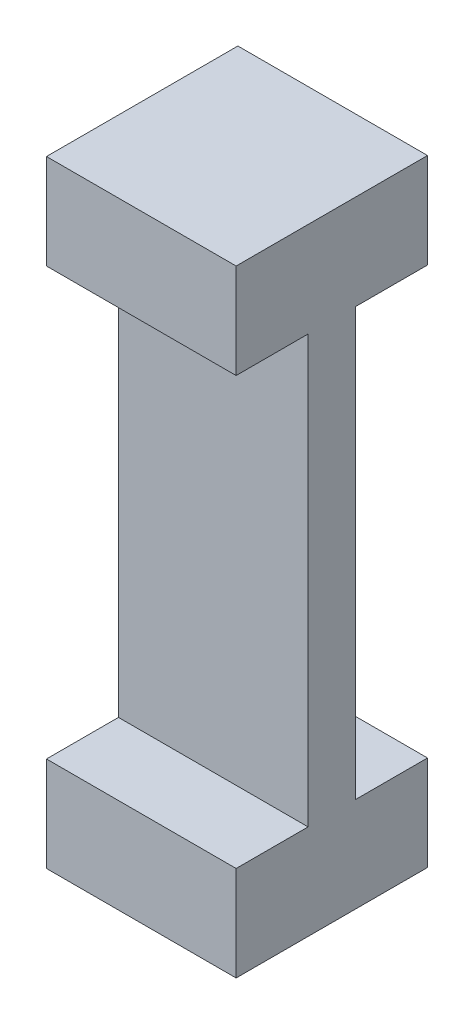
ISO-10303-21;
HEADER;
FILE_DESCRIPTION(('STEP AP214'),'2;1');
FILE_NAME('part.step','',(''),(''),'','','');
FILE_SCHEMA(('AUTOMOTIVE_DESIGN { 1 0 10303 214 1 1 1 1 }'));
ENDSEC;
DATA;
#1=APPLICATION_CONTEXT('core data for automotive mechanical design processes');
#2=APPLICATION_PROTOCOL_DEFINITION('international standard','automotive_design',2000,#1);
#3=PRODUCT_CONTEXT('',#1,'mechanical');
#4=PRODUCT('Part','Part','',(#3));
#5=PRODUCT_RELATED_PRODUCT_CATEGORY('part','',(#4));
#6=PRODUCT_DEFINITION_FORMATION('','',#4);
#7=PRODUCT_DEFINITION_CONTEXT('part definition',#1,'design');
#8=PRODUCT_DEFINITION('design','',#6,#7);
#9=PRODUCT_DEFINITION_SHAPE('','',#8);
#10=(LENGTH_UNIT() NAMED_UNIT(*) SI_UNIT(.MILLI.,.METRE.));
#11=(NAMED_UNIT(*) PLANE_ANGLE_UNIT() SI_UNIT($,.RADIAN.));
#12=(NAMED_UNIT(*) SI_UNIT($,.STERADIAN.) SOLID_ANGLE_UNIT());
#13=UNCERTAINTY_MEASURE_WITH_UNIT(LENGTH_MEASURE(1.E-05),#10,'distance_accuracy_value','');
#14=(GEOMETRIC_REPRESENTATION_CONTEXT(3) GLOBAL_UNCERTAINTY_ASSIGNED_CONTEXT((#13)) GLOBAL_UNIT_ASSIGNED_CONTEXT((#10,
#11,#12)) REPRESENTATION_CONTEXT('',''));
#15=CARTESIAN_POINT('',(0.,0.,0.));
#16=DIRECTION('',(0.,0.,1.));
#17=DIRECTION('',(1.,0.,0.));
#18=AXIS2_PLACEMENT_3D('',#15,#16,#17);
#19=CARTESIAN_POINT('',(48.4000143814819,130.,40.3791279410926));
#20=DIRECTION('',(-1.,0.,0.));
#21=DIRECTION('',(0.,0.,1.));
#22=AXIS2_PLACEMENT_3D('',#19,#20,#21);
#23=PLANE('',#22);
#24=DIRECTION('',(0.,-1.,0.));
#25=VECTOR('',#24,1.);
#26=CARTESIAN_POINT('',(48.4000143814819,360.,-9.97329326461638));
#27=LINE('',#26,#25);
#28=CARTESIAN_POINT('',(48.4000143814819,220.,-9.97329326461634));
#29=VERTEX_POINT('',#28);
#30=CARTESIAN_POINT('',(48.4000143814819,40.,-9.97329326461634));
#31=VERTEX_POINT('',#30);
#32=EDGE_CURVE('E174',#29,#31,#27,.T.);
#33=ORIENTED_EDGE('',*,*,#32,.F.);
#34=DIRECTION('',(0.,0.,-1.));
#35=VECTOR('',#34,1.);
#36=CARTESIAN_POINT('',(48.4000143814819,220.,-9.97329326461634));
#37=LINE('',#36,#35);
#38=CARTESIAN_POINT('',(48.4000143814819,220.,-40.3257144703254));
#39=VERTEX_POINT('',#38);
#40=EDGE_CURVE('E150',#29,#39,#37,.T.);
#41=ORIENTED_EDGE('',*,*,#40,.T.);
#42=DIRECTION('',(0.,1.,0.));
#43=VECTOR('',#42,1.);
#44=CARTESIAN_POINT('',(48.4000143814819,130.,-40.3257144703254));
#45=LINE('',#44,#43);
#46=CARTESIAN_POINT('',(48.4000143814819,260.,-40.3257144703254));
#47=VERTEX_POINT('',#46);
#48=EDGE_CURVE('E165',#39,#47,#45,.T.);
#49=ORIENTED_EDGE('',*,*,#48,.T.);
#50=DIRECTION('',(0.,0.,-1.));
#51=VECTOR('',#50,1.);
#52=CARTESIAN_POINT('',(48.4000143814819,260.,40.3791279410926));
#53=LINE('',#52,#51);
#54=CARTESIAN_POINT('',(48.4000143814819,260.,40.3791279410926));
#55=VERTEX_POINT('',#54);
#56=EDGE_CURVE('E154',#55,#47,#53,.T.);
#57=ORIENTED_EDGE('',*,*,#56,.F.);
#58=DIRECTION('',(0.,1.,0.));
#59=VECTOR('',#58,1.);
#60=CARTESIAN_POINT('',(48.4000143814819,130.,40.3791279410926));
#61=LINE('',#60,#59);
#62=CARTESIAN_POINT('',(48.4000143814819,220.,40.3791279410926));
#63=VERTEX_POINT('',#62);
#64=EDGE_CURVE('E135',#63,#55,#61,.T.);
#65=ORIENTED_EDGE('',*,*,#64,.F.);
#66=DIRECTION('',(0.,0.,-1.));
#67=VECTOR('',#66,1.);
#68=CARTESIAN_POINT('',(48.4000143814819,220.,10.0267067353836));
#69=LINE('',#68,#67);
#70=CARTESIAN_POINT('',(48.4000143814819,220.,10.0267067353836));
#71=VERTEX_POINT('',#70);
#72=EDGE_CURVE('E143',#63,#71,#69,.T.);
#73=ORIENTED_EDGE('',*,*,#72,.T.);
#74=DIRECTION('',(0.,1.,0.));
#75=VECTOR('',#74,1.);
#76=CARTESIAN_POINT('',(48.4000143814819,360.,10.0267067353836));
#77=LINE('',#76,#75);
#78=CARTESIAN_POINT('',(48.4000143814819,40.,10.0267067353836));
#79=VERTEX_POINT('',#78);
#80=EDGE_CURVE('E173',#79,#71,#77,.T.);
#81=ORIENTED_EDGE('',*,*,#80,.F.);
#82=DIRECTION('',(0.,0.,-1.));
#83=VECTOR('',#82,1.);
#84=CARTESIAN_POINT('',(48.4000143814819,40.,10.0267067353836));
#85=LINE('',#84,#83);
#86=CARTESIAN_POINT('',(48.4000143814819,40.,40.3791279410926));
#87=VERTEX_POINT('',#86);
#88=EDGE_CURVE('E170',#87,#79,#85,.T.);
#89=ORIENTED_EDGE('',*,*,#88,.F.);
#90=DIRECTION('',(0.,-1.,0.));
#91=VECTOR('',#90,1.);
#92=CARTESIAN_POINT('',(48.4000143814819,130.,40.3791279410926));
#93=LINE('',#92,#91);
#94=CARTESIAN_POINT('',(48.4000143814819,0.,40.3791279410926));
#95=VERTEX_POINT('',#94);
#96=EDGE_CURVE('E54',#87,#95,#93,.T.);
#97=ORIENTED_EDGE('',*,*,#96,.T.);
#98=DIRECTION('',(0.,0.,-1.));
#99=VECTOR('',#98,1.);
#100=CARTESIAN_POINT('',(48.4000143814819,0.,40.3791279410926));
#101=LINE('',#100,#99);
#102=CARTESIAN_POINT('',(48.4000143814819,0.,-40.3257144703254));
#103=VERTEX_POINT('',#102);
#104=EDGE_CURVE('E196',#95,#103,#101,.T.);
#105=ORIENTED_EDGE('',*,*,#104,.T.);
#106=DIRECTION('',(0.,-1.,0.));
#107=VECTOR('',#106,1.);
#108=CARTESIAN_POINT('',(48.4000143814819,130.,-40.3257144703254));
#109=LINE('',#108,#107);
#110=CARTESIAN_POINT('',(48.4000143814819,40.,-40.3257144703254));
#111=VERTEX_POINT('',#110);
#112=EDGE_CURVE('E47',#111,#103,#109,.T.);
#113=ORIENTED_EDGE('',*,*,#112,.F.);
#114=DIRECTION('',(0.,0.,-1.));
#115=VECTOR('',#114,1.);
#116=CARTESIAN_POINT('',(48.4000143814819,40.,-9.97329326461634));
#117=LINE('',#116,#115);
#118=EDGE_CURVE('E183',#31,#111,#117,.T.);
#119=ORIENTED_EDGE('',*,*,#118,.F.);
#120=EDGE_LOOP('',(#33,#41,#49,#57,#65,#73,#81,#89,#97,#105,#113,#119));
#121=FACE_BOUND('',#120,.T.);
#122=ADVANCED_FACE('F40',(#121),#23,.F.);
#123=CARTESIAN_POINT('',(-31.5680633759712,130.,-40.3257144703254));
#124=DIRECTION('',(0.,0.,1.));
#125=DIRECTION('',(1.,0.,0.));
#126=AXIS2_PLACEMENT_3D('',#123,#124,#125);
#127=PLANE('',#126);
#128=DIRECTION('',(0.,-1.,0.));
#129=VECTOR('',#128,1.);
#130=CARTESIAN_POINT('',(-31.5680633759712,130.,-40.3257144703254));
#131=LINE('',#130,#129);
#132=CARTESIAN_POINT('',(-31.5680633759712,40.,-40.3257144703254));
#133=VERTEX_POINT('',#132);
#134=CARTESIAN_POINT('',(-31.5680633759712,0.,-40.3257144703254));
#135=VERTEX_POINT('',#134);
#136=EDGE_CURVE('E207',#133,#135,#131,.T.);
#137=ORIENTED_EDGE('',*,*,#136,.F.);
#138=DIRECTION('',(1.,0.,0.));
#139=VECTOR('',#138,1.);
#140=CARTESIAN_POINT('',(-31.5999856185181,40.,-40.3257144703254));
#141=LINE('',#140,#139);
#142=EDGE_CURVE('E169',#133,#111,#141,.T.);
#143=ORIENTED_EDGE('',*,*,#142,.T.);
#144=ORIENTED_EDGE('',*,*,#112,.T.);
#145=DIRECTION('',(-1.,0.,0.));
#146=VECTOR('',#145,1.);
#147=CARTESIAN_POINT('',(-31.5680633759712,0.,-40.3257144703254));
#148=LINE('',#147,#146);
#149=EDGE_CURVE('E198',#103,#135,#148,.T.);
#150=ORIENTED_EDGE('',*,*,#149,.T.);
#151=EDGE_LOOP('',(#137,#143,#144,#150));
#152=FACE_BOUND('',#151,.T.);
#153=ADVANCED_FACE('F212',(#152),#127,.F.);
#154=CARTESIAN_POINT('',(-31.5680633759712,130.,40.3791279410926));
#155=DIRECTION('',(1.,0.,0.));
#156=DIRECTION('',(0.,0.,-1.));
#157=AXIS2_PLACEMENT_3D('',#154,#155,#156);
#158=PLANE('',#157);
#159=DIRECTION('',(0.,0.,-1.));
#160=VECTOR('',#159,1.);
#161=CARTESIAN_POINT('',(-31.5680633759712,40.,40.3791279410926));
#162=LINE('',#161,#160);
#163=CARTESIAN_POINT('',(-31.5680633759712,40.,40.3791279410926));
#164=VERTEX_POINT('',#163);
#165=CARTESIAN_POINT('',(-31.5680633759712,40.,10.0267067353836));
#166=VERTEX_POINT('',#165);
#167=EDGE_CURVE('E193',#164,#166,#162,.T.);
#168=ORIENTED_EDGE('',*,*,#167,.T.);
#169=DIRECTION('',(0.,1.,0.));
#170=VECTOR('',#169,1.);
#171=CARTESIAN_POINT('',(-31.5680633759712,130.,10.0267067353836));
#172=LINE('',#171,#170);
#173=CARTESIAN_POINT('',(-31.5680633759712,220.,10.0267067353836));
#174=VERTEX_POINT('',#173);
#175=EDGE_CURVE('E191',#166,#174,#172,.T.);
#176=ORIENTED_EDGE('',*,*,#175,.T.);
#177=DIRECTION('',(0.,0.,-1.));
#178=VECTOR('',#177,1.);
#179=CARTESIAN_POINT('',(-31.5680633759712,220.,40.3791279410926));
#180=LINE('',#179,#178);
#181=CARTESIAN_POINT('',(-31.5680633759712,220.,40.3791279410926));
#182=VERTEX_POINT('',#181);
#183=EDGE_CURVE('E239',#182,#174,#180,.T.);
#184=ORIENTED_EDGE('',*,*,#183,.F.);
#185=DIRECTION('',(0.,1.,0.));
#186=VECTOR('',#185,1.);
#187=CARTESIAN_POINT('',(-31.5680633759712,130.,40.3791279410926));
#188=LINE('',#187,#186);
#189=CARTESIAN_POINT('',(-31.5680633759712,260.,40.3791279410926));
#190=VERTEX_POINT('',#189);
#191=EDGE_CURVE('E138',#182,#190,#188,.T.);
#192=ORIENTED_EDGE('',*,*,#191,.T.);
#193=DIRECTION('',(0.,0.,1.));
#194=VECTOR('',#193,1.);
#195=CARTESIAN_POINT('',(-31.5680633759712,260.,40.3791279410926));
#196=LINE('',#195,#194);
#197=CARTESIAN_POINT('',(-31.5680633759712,260.,-40.3257144703254));
#198=VERTEX_POINT('',#197);
#199=EDGE_CURVE('E159',#198,#190,#196,.T.);
#200=ORIENTED_EDGE('',*,*,#199,.F.);
#201=DIRECTION('',(0.,1.,0.));
#202=VECTOR('',#201,1.);
#203=CARTESIAN_POINT('',(-31.5680633759712,130.,-40.3257144703254));
#204=LINE('',#203,#202);
#205=CARTESIAN_POINT('',(-31.5680633759712,220.,-40.3257144703254));
#206=VERTEX_POINT('',#205);
#207=EDGE_CURVE('E157',#206,#198,#204,.T.);
#208=ORIENTED_EDGE('',*,*,#207,.F.);
#209=DIRECTION('',(0.,0.,-1.));
#210=VECTOR('',#209,1.);
#211=CARTESIAN_POINT('',(-31.5680633759712,220.,40.3791279410926));
#212=LINE('',#211,#210);
#213=CARTESIAN_POINT('',(-31.5680633759712,220.,-9.97329326461634));
#214=VERTEX_POINT('',#213);
#215=EDGE_CURVE('E167',#214,#206,#212,.T.);
#216=ORIENTED_EDGE('',*,*,#215,.F.);
#217=DIRECTION('',(0.,-1.,0.));
#218=VECTOR('',#217,1.);
#219=CARTESIAN_POINT('',(-31.5680633759712,130.,-9.97329326461635));
#220=LINE('',#219,#218);
#221=CARTESIAN_POINT('',(-31.5680633759712,40.,-9.97329326461634));
#222=VERTEX_POINT('',#221);
#223=EDGE_CURVE('E179',#214,#222,#220,.T.);
#224=ORIENTED_EDGE('',*,*,#223,.T.);
#225=DIRECTION('',(0.,0.,-1.));
#226=VECTOR('',#225,1.);
#227=CARTESIAN_POINT('',(-31.5680633759712,40.,40.3791279410926));
#228=LINE('',#227,#226);
#229=EDGE_CURVE('E12',#222,#133,#228,.T.);
#230=ORIENTED_EDGE('',*,*,#229,.T.);
#231=ORIENTED_EDGE('',*,*,#136,.T.);
#232=DIRECTION('',(0.,0.,1.));
#233=VECTOR('',#232,1.);
#234=CARTESIAN_POINT('',(-31.5680633759712,0.,40.3791279410926));
#235=LINE('',#234,#233);
#236=CARTESIAN_POINT('',(-31.5680633759712,0.,40.3791279410926));
#237=VERTEX_POINT('',#236);
#238=EDGE_CURVE('E201',#135,#237,#235,.T.);
#239=ORIENTED_EDGE('',*,*,#238,.T.);
#240=DIRECTION('',(0.,-1.,0.));
#241=VECTOR('',#240,1.);
#242=CARTESIAN_POINT('',(-31.5680633759712,130.,40.3791279410926));
#243=LINE('',#242,#241);
#244=EDGE_CURVE('E61',#164,#237,#243,.T.);
#245=ORIENTED_EDGE('',*,*,#244,.F.);
#246=EDGE_LOOP('',(#168,#176,#184,#192,#200,#208,#216,#224,#230,#231,#239,#245));
#247=FACE_BOUND('',#246,.T.);
#248=ADVANCED_FACE('F220',(#247),#158,.F.);
#249=CARTESIAN_POINT('',(-31.5680633759712,130.,40.3791279410926));
#250=DIRECTION('',(0.,0.,-1.));
#251=DIRECTION('',(-1.,0.,0.));
#252=AXIS2_PLACEMENT_3D('',#249,#250,#251);
#253=PLANE('',#252);
#254=ORIENTED_EDGE('',*,*,#96,.F.);
#255=DIRECTION('',(1.,0.,0.));
#256=VECTOR('',#255,1.);
#257=CARTESIAN_POINT('',(-31.5999856185181,40.,40.3791279410926));
#258=LINE('',#257,#256);
#259=EDGE_CURVE('E176',#164,#87,#258,.T.);
#260=ORIENTED_EDGE('',*,*,#259,.F.);
#261=ORIENTED_EDGE('',*,*,#244,.T.);
#262=DIRECTION('',(1.,0.,0.));
#263=VECTOR('',#262,1.);
#264=CARTESIAN_POINT('',(-31.5680633759712,0.,40.3791279410926));
#265=LINE('',#264,#263);
#266=EDGE_CURVE('E203',#237,#95,#265,.T.);
#267=ORIENTED_EDGE('',*,*,#266,.T.);
#268=EDGE_LOOP('',(#254,#260,#261,#267));
#269=FACE_BOUND('',#268,.T.);
#270=ADVANCED_FACE('F253',(#269),#253,.F.);
#271=CARTESIAN_POINT('',(0.,0.,0.));
#272=DIRECTION('',(0.,-1.,0.));
#273=DIRECTION('',(0.,0.,-1.));
#274=AXIS2_PLACEMENT_3D('',#271,#272,#273);
#275=PLANE('',#274);
#276=ORIENTED_EDGE('',*,*,#104,.F.);
#277=ORIENTED_EDGE('',*,*,#266,.F.);
#278=ORIENTED_EDGE('',*,*,#238,.F.);
#279=ORIENTED_EDGE('',*,*,#149,.F.);
#280=EDGE_LOOP('',(#276,#277,#278,#279));
#281=FACE_BOUND('',#280,.T.);
#282=ADVANCED_FACE('F217',(#281),#275,.T.);
#283=CARTESIAN_POINT('',(-31.5999856185181,40.,-9.97329326461634));
#284=DIRECTION('',(0.,-1.,0.));
#285=DIRECTION('',(0.,0.,-1.));
#286=AXIS2_PLACEMENT_3D('',#283,#284,#285);
#287=PLANE('',#286);
#288=DIRECTION('',(1.,0.,0.));
#289=VECTOR('',#288,1.);
#290=CARTESIAN_POINT('',(-31.5999856185181,40.,-9.97329326461634));
#291=LINE('',#290,#289);
#292=EDGE_CURVE('E181',#222,#31,#291,.T.);
#293=ORIENTED_EDGE('',*,*,#292,.T.);
#294=ORIENTED_EDGE('',*,*,#118,.T.);
#295=ORIENTED_EDGE('',*,*,#142,.F.);
#296=ORIENTED_EDGE('',*,*,#229,.F.);
#297=EDGE_LOOP('',(#293,#294,#295,#296));
#298=FACE_BOUND('',#297,.T.);
#299=ADVANCED_FACE('F224',(#298),#287,.F.);
#300=CARTESIAN_POINT('',(-31.5999856185181,360.,-9.97329326461638));
#301=DIRECTION('',(0.,0.,1.));
#302=DIRECTION('',(0.,-1.,0.));
#303=AXIS2_PLACEMENT_3D('',#300,#301,#302);
#304=PLANE('',#303);
#305=ORIENTED_EDGE('',*,*,#223,.F.);
#306=DIRECTION('',(1.,0.,0.));
#307=VECTOR('',#306,1.);
#308=CARTESIAN_POINT('',(-31.5999856185181,220.,-9.97329326461634));
#309=LINE('',#308,#307);
#310=EDGE_CURVE('E229',#214,#29,#309,.T.);
#311=ORIENTED_EDGE('',*,*,#310,.T.);
#312=ORIENTED_EDGE('',*,*,#32,.T.);
#313=ORIENTED_EDGE('',*,*,#292,.F.);
#314=EDGE_LOOP('',(#305,#311,#312,#313));
#315=FACE_BOUND('',#314,.T.);
#316=ADVANCED_FACE('F226',(#315),#304,.F.);
#317=CARTESIAN_POINT('',(-31.5999856185181,40.,10.0267067353836));
#318=DIRECTION('',(0.,-1.,0.));
#319=DIRECTION('',(0.,0.,-1.));
#320=AXIS2_PLACEMENT_3D('',#317,#318,#319);
#321=PLANE('',#320);
#322=ORIENTED_EDGE('',*,*,#259,.T.);
#323=ORIENTED_EDGE('',*,*,#88,.T.);
#324=DIRECTION('',(1.,0.,0.));
#325=VECTOR('',#324,1.);
#326=CARTESIAN_POINT('',(-31.5999856185181,40.,10.0267067353836));
#327=LINE('',#326,#325);
#328=EDGE_CURVE('E177',#166,#79,#327,.T.);
#329=ORIENTED_EDGE('',*,*,#328,.F.);
#330=ORIENTED_EDGE('',*,*,#167,.F.);
#331=EDGE_LOOP('',(#322,#323,#329,#330));
#332=FACE_BOUND('',#331,.T.);
#333=ADVANCED_FACE('F254',(#332),#321,.F.);
#334=CARTESIAN_POINT('',(-31.5999856185181,360.,10.0267067353836));
#335=DIRECTION('',(0.,0.,-1.));
#336=DIRECTION('',(0.,1.,0.));
#337=AXIS2_PLACEMENT_3D('',#334,#335,#336);
#338=PLANE('',#337);
#339=ORIENTED_EDGE('',*,*,#328,.T.);
#340=ORIENTED_EDGE('',*,*,#80,.T.);
#341=DIRECTION('',(1.,0.,0.));
#342=VECTOR('',#341,1.);
#343=CARTESIAN_POINT('',(-31.5999856185181,220.,10.0267067353836));
#344=LINE('',#343,#342);
#345=EDGE_CURVE('E142',#174,#71,#344,.T.);
#346=ORIENTED_EDGE('',*,*,#345,.F.);
#347=ORIENTED_EDGE('',*,*,#175,.F.);
#348=EDGE_LOOP('',(#339,#340,#346,#347));
#349=FACE_BOUND('',#348,.T.);
#350=ADVANCED_FACE('F250',(#349),#338,.F.);
#351=CARTESIAN_POINT('',(-31.5680633759712,130.,-40.3257144703254));
#352=DIRECTION('',(0.,0.,1.));
#353=DIRECTION('',(1.,0.,0.));
#354=AXIS2_PLACEMENT_3D('',#351,#352,#353);
#355=PLANE('',#354);
#356=ORIENTED_EDGE('',*,*,#207,.T.);
#357=DIRECTION('',(-1.,0.,0.));
#358=VECTOR('',#357,1.);
#359=CARTESIAN_POINT('',(-31.5680633759712,260.,-40.3257144703254));
#360=LINE('',#359,#358);
#361=EDGE_CURVE('E242',#47,#198,#360,.T.);
#362=ORIENTED_EDGE('',*,*,#361,.F.);
#363=ORIENTED_EDGE('',*,*,#48,.F.);
#364=DIRECTION('',(1.,0.,0.));
#365=VECTOR('',#364,1.);
#366=CARTESIAN_POINT('',(-31.5999856185181,220.,-40.3257144703254));
#367=LINE('',#366,#365);
#368=EDGE_CURVE('E235',#206,#39,#367,.T.);
#369=ORIENTED_EDGE('',*,*,#368,.F.);
#370=EDGE_LOOP('',(#356,#362,#363,#369));
#371=FACE_BOUND('',#370,.T.);
#372=ADVANCED_FACE('F261',(#371),#355,.F.);
#373=CARTESIAN_POINT('',(-31.5680633759712,130.,40.3791279410926));
#374=DIRECTION('',(0.,0.,-1.));
#375=DIRECTION('',(-1.,0.,0.));
#376=AXIS2_PLACEMENT_3D('',#373,#374,#375);
#377=PLANE('',#376);
#378=ORIENTED_EDGE('',*,*,#64,.T.);
#379=DIRECTION('',(1.,0.,0.));
#380=VECTOR('',#379,1.);
#381=CARTESIAN_POINT('',(-31.5680633759712,260.,40.3791279410926));
#382=LINE('',#381,#380);
#383=EDGE_CURVE('E155',#190,#55,#382,.T.);
#384=ORIENTED_EDGE('',*,*,#383,.F.);
#385=ORIENTED_EDGE('',*,*,#191,.F.);
#386=DIRECTION('',(1.,0.,0.));
#387=VECTOR('',#386,1.);
#388=CARTESIAN_POINT('',(-31.5999856185181,220.,40.3791279410926));
#389=LINE('',#388,#387);
#390=EDGE_CURVE('E131',#182,#63,#389,.T.);
#391=ORIENTED_EDGE('',*,*,#390,.T.);
#392=EDGE_LOOP('',(#378,#384,#385,#391));
#393=FACE_BOUND('',#392,.T.);
#394=ADVANCED_FACE('F133',(#393),#377,.F.);
#395=CARTESIAN_POINT('',(0.,260.,0.));
#396=DIRECTION('',(0.,1.,0.));
#397=DIRECTION('',(0.,0.,-1.));
#398=AXIS2_PLACEMENT_3D('',#395,#396,#397);
#399=PLANE('',#398);
#400=ORIENTED_EDGE('',*,*,#56,.T.);
#401=ORIENTED_EDGE('',*,*,#361,.T.);
#402=ORIENTED_EDGE('',*,*,#199,.T.);
#403=ORIENTED_EDGE('',*,*,#383,.T.);
#404=EDGE_LOOP('',(#400,#401,#402,#403));
#405=FACE_BOUND('',#404,.T.);
#406=ADVANCED_FACE('F246',(#405),#399,.T.);
#407=CARTESIAN_POINT('',(-31.5999856185181,220.,-9.97329326461634));
#408=DIRECTION('',(0.,1.,0.));
#409=DIRECTION('',(0.,0.,-1.));
#410=AXIS2_PLACEMENT_3D('',#407,#408,#409);
#411=PLANE('',#410);
#412=ORIENTED_EDGE('',*,*,#310,.F.);
#413=ORIENTED_EDGE('',*,*,#215,.T.);
#414=ORIENTED_EDGE('',*,*,#368,.T.);
#415=ORIENTED_EDGE('',*,*,#40,.F.);
#416=EDGE_LOOP('',(#412,#413,#414,#415));
#417=FACE_BOUND('',#416,.T.);
#418=ADVANCED_FACE('F327',(#417),#411,.F.);
#419=CARTESIAN_POINT('',(-31.5999856185181,220.,10.0267067353836));
#420=DIRECTION('',(0.,1.,0.));
#421=DIRECTION('',(0.,0.,-1.));
#422=AXIS2_PLACEMENT_3D('',#419,#420,#421);
#423=PLANE('',#422);
#424=ORIENTED_EDGE('',*,*,#390,.F.);
#425=ORIENTED_EDGE('',*,*,#183,.T.);
#426=ORIENTED_EDGE('',*,*,#345,.T.);
#427=ORIENTED_EDGE('',*,*,#72,.F.);
#428=EDGE_LOOP('',(#424,#425,#426,#427));
#429=FACE_BOUND('',#428,.T.);
#430=ADVANCED_FACE('F147',(#429),#423,.F.);
#431=CLOSED_SHELL('',(#122,#153,#248,#270,#282,#299,#316,#333,#350,#372,#394,#406,#418,#430));
#432=MANIFOLD_SOLID_BREP('B2',#431);
#433=ADVANCED_BREP_SHAPE_REPRESENTATION('',(#18,#432),#14);
#434=SHAPE_DEFINITION_REPRESENTATION(#9,#433);
ENDSEC;
END-ISO-10303-21;
